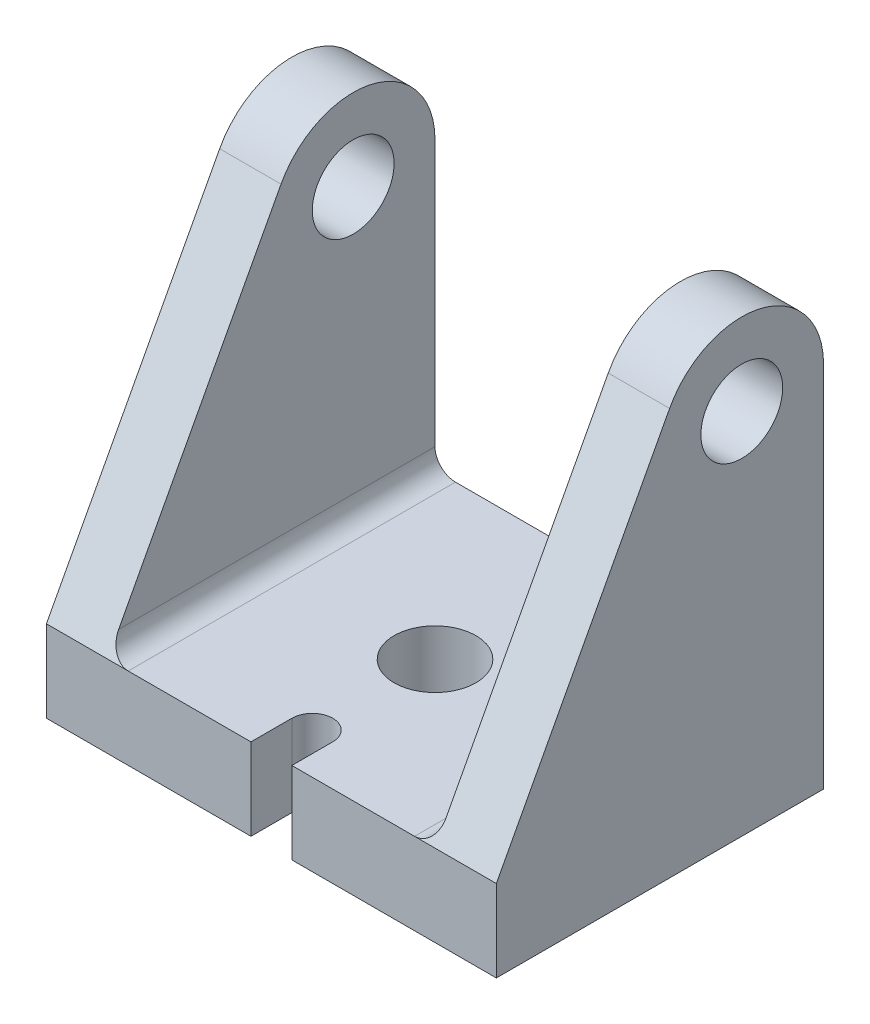
ISO-10303-21;
HEADER;
FILE_DESCRIPTION(('STEP AP214'),'2;1');
FILE_NAME('part.step','',(''),(''),'','','');
FILE_SCHEMA(('AUTOMOTIVE_DESIGN { 1 0 10303 214 1 1 1 1 }'));
ENDSEC;
DATA;
#1=APPLICATION_CONTEXT('core data for automotive mechanical design processes');
#2=APPLICATION_PROTOCOL_DEFINITION('international standard','automotive_design',2000,#1);
#3=PRODUCT_CONTEXT('',#1,'mechanical');
#4=PRODUCT('Part','Part','',(#3));
#5=PRODUCT_RELATED_PRODUCT_CATEGORY('part','',(#4));
#6=PRODUCT_DEFINITION_FORMATION('','',#4);
#7=PRODUCT_DEFINITION_CONTEXT('part definition',#1,'design');
#8=PRODUCT_DEFINITION('design','',#6,#7);
#9=PRODUCT_DEFINITION_SHAPE('','',#8);
#10=(LENGTH_UNIT() NAMED_UNIT(*) SI_UNIT(.MILLI.,.METRE.));
#11=(NAMED_UNIT(*) PLANE_ANGLE_UNIT() SI_UNIT($,.RADIAN.));
#12=(NAMED_UNIT(*) SI_UNIT($,.STERADIAN.) SOLID_ANGLE_UNIT());
#13=UNCERTAINTY_MEASURE_WITH_UNIT(LENGTH_MEASURE(1.E-05),#10,'distance_accuracy_value','');
#14=(GEOMETRIC_REPRESENTATION_CONTEXT(3) GLOBAL_UNCERTAINTY_ASSIGNED_CONTEXT((#13)) GLOBAL_UNIT_ASSIGNED_CONTEXT((#10,
#11,#12)) REPRESENTATION_CONTEXT('',''));
#15=CARTESIAN_POINT('',(0.,0.,0.));
#16=DIRECTION('',(0.,0.,1.));
#17=DIRECTION('',(1.,0.,0.));
#18=AXIS2_PLACEMENT_3D('',#15,#16,#17);
#19=CARTESIAN_POINT('',(-34.925,12.7,25.4));
#20=DIRECTION('',(0.,0.,-1.));
#21=DIRECTION('',(-1.,0.,0.));
#22=AXIS2_PLACEMENT_3D('',#19,#20,#21);
#23=PLANE('',#22);
#24=DIRECTION('',(1.,0.,0.));
#25=VECTOR('',#24,1.);
#26=CARTESIAN_POINT('',(-34.925,12.7,25.4));
#27=LINE('',#26,#25);
#28=CARTESIAN_POINT('',(3.175,12.7,25.4));
#29=VERTEX_POINT('',#28);
#30=CARTESIAN_POINT('',(22.225,12.7,25.4));
#31=VERTEX_POINT('',#30);
#32=EDGE_CURVE('E265',#29,#31,#27,.T.);
#33=ORIENTED_EDGE('',*,*,#32,.F.);
#34=DIRECTION('',(0.,1.,0.));
#35=VECTOR('',#34,1.);
#36=CARTESIAN_POINT('',(3.175,0.,25.4));
#37=LINE('',#36,#35);
#38=CARTESIAN_POINT('',(3.175,0.,25.4));
#39=VERTEX_POINT('',#38);
#40=EDGE_CURVE('E157',#39,#29,#37,.T.);
#41=ORIENTED_EDGE('',*,*,#40,.F.);
#42=DIRECTION('',(1.,0.,0.));
#43=VECTOR('',#42,1.);
#44=CARTESIAN_POINT('',(-34.925,0.,25.4));
#45=LINE('',#44,#43);
#46=CARTESIAN_POINT('',(34.925,0.,25.4));
#47=VERTEX_POINT('',#46);
#48=EDGE_CURVE('E273',#39,#47,#45,.T.);
#49=ORIENTED_EDGE('',*,*,#48,.T.);
#50=DIRECTION('',(0.,-1.,0.));
#51=VECTOR('',#50,1.);
#52=CARTESIAN_POINT('',(34.925,12.7,25.4));
#53=LINE('',#52,#51);
#54=CARTESIAN_POINT('',(34.925,12.7,25.4));
#55=VERTEX_POINT('',#54);
#56=EDGE_CURVE('E291',#55,#47,#53,.T.);
#57=ORIENTED_EDGE('',*,*,#56,.F.);
#58=DIRECTION('',(1.,0.,0.));
#59=VECTOR('',#58,1.);
#60=CARTESIAN_POINT('',(25.4,12.7,25.4));
#61=LINE('',#60,#59);
#62=EDGE_CURVE('E60',#31,#55,#61,.T.);
#63=ORIENTED_EDGE('',*,*,#62,.F.);
#64=EDGE_LOOP('',(#33,#41,#49,#57,#63));
#65=FACE_BOUND('',#64,.T.);
#66=ADVANCED_FACE('F43',(#65),#23,.F.);
#67=CARTESIAN_POINT('',(0.,12.7,0.));
#68=DIRECTION('',(0.,1.,0.));
#69=DIRECTION('',(0.,0.,1.));
#70=AXIS2_PLACEMENT_3D('',#67,#68,#69);
#71=PLANE('',#70);
#72=CARTESIAN_POINT('',(0.,12.7,0.));
#73=DIRECTION('',(0.,1.,0.));
#74=DIRECTION('',(0.,0.,1.));
#75=AXIS2_PLACEMENT_3D('',#72,#73,#74);
#76=CIRCLE('',#75,6.35);
#77=CARTESIAN_POINT('',(0.,12.7,6.35));
#78=VERTEX_POINT('',#77);
#79=EDGE_CURVE('E170',#78,#78,#76,.T.);
#80=ORIENTED_EDGE('',*,*,#79,.F.);
#81=EDGE_LOOP('',(#80));
#82=FACE_BOUND('',#81,.T.);
#83=ORIENTED_EDGE('',*,*,#32,.T.);
#84=DIRECTION('',(0.,0.,-1.));
#85=VECTOR('',#84,1.);
#86=CARTESIAN_POINT('',(22.225,12.7,-25.4));
#87=LINE('',#86,#85);
#88=CARTESIAN_POINT('',(22.225,12.7,-25.4));
#89=VERTEX_POINT('',#88);
#90=EDGE_CURVE('E303',#31,#89,#87,.T.);
#91=ORIENTED_EDGE('',*,*,#90,.T.);
#92=DIRECTION('',(-1.,0.,0.));
#93=VECTOR('',#92,1.);
#94=CARTESIAN_POINT('',(-34.925,12.7,-25.4));
#95=LINE('',#94,#93);
#96=CARTESIAN_POINT('',(-22.225,12.7,-25.4));
#97=VERTEX_POINT('',#96);
#98=EDGE_CURVE('E263',#89,#97,#95,.T.);
#99=ORIENTED_EDGE('',*,*,#98,.T.);
#100=DIRECTION('',(0.,0.,-1.));
#101=VECTOR('',#100,1.);
#102=CARTESIAN_POINT('',(-22.225,12.7,25.4));
#103=LINE('',#102,#101);
#104=CARTESIAN_POINT('',(-22.225,12.7,25.4));
#105=VERTEX_POINT('',#104);
#106=EDGE_CURVE('E299',#97,#105,#103,.F.);
#107=ORIENTED_EDGE('',*,*,#106,.T.);
#108=CARTESIAN_POINT('',(-3.175,12.7,25.4));
#109=VERTEX_POINT('',#108);
#110=EDGE_CURVE('E264',#105,#109,#27,.T.);
#111=ORIENTED_EDGE('',*,*,#110,.T.);
#112=DIRECTION('',(0.,0.,1.));
#113=VECTOR('',#112,1.);
#114=CARTESIAN_POINT('',(-3.175,12.7,19.05));
#115=LINE('',#114,#113);
#116=CARTESIAN_POINT('',(-3.175,12.7,19.05));
#117=VERTEX_POINT('',#116);
#118=EDGE_CURVE('E165',#117,#109,#115,.T.);
#119=ORIENTED_EDGE('',*,*,#118,.F.);
#120=CARTESIAN_POINT('',(0.,12.7,19.05));
#121=DIRECTION('',(0.,1.,0.));
#122=DIRECTION('',(0.,0.,1.));
#123=AXIS2_PLACEMENT_3D('',#120,#121,#122);
#124=CIRCLE('',#123,3.175);
#125=CARTESIAN_POINT('',(3.175,12.7,19.05));
#126=VERTEX_POINT('',#125);
#127=EDGE_CURVE('E150',#126,#117,#124,.T.);
#128=ORIENTED_EDGE('',*,*,#127,.F.);
#129=DIRECTION('',(0.,0.,-1.));
#130=VECTOR('',#129,1.);
#131=CARTESIAN_POINT('',(3.175,12.7,19.05));
#132=LINE('',#131,#130);
#133=EDGE_CURVE('E160',#29,#126,#132,.T.);
#134=ORIENTED_EDGE('',*,*,#133,.F.);
#135=EDGE_LOOP('',(#83,#91,#99,#107,#111,#119,#128,#134));
#136=FACE_BOUND('',#135,.T.);
#137=ADVANCED_FACE('F167',(#82,#136),#71,.T.);
#138=CARTESIAN_POINT('',(-34.925,12.7,-25.4));
#139=DIRECTION('',(1.,0.,0.));
#140=DIRECTION('',(0.,0.,-1.));
#141=AXIS2_PLACEMENT_3D('',#138,#139,#140);
#142=PLANE('',#141);
#143=DIRECTION('',(0.,0.,1.));
#144=VECTOR('',#143,1.);
#145=CARTESIAN_POINT('',(-34.925,0.,-25.4));
#146=LINE('',#145,#144);
#147=CARTESIAN_POINT('',(-34.925,0.,-25.4));
#148=VERTEX_POINT('',#147);
#149=CARTESIAN_POINT('',(-34.925,0.,25.4));
#150=VERTEX_POINT('',#149);
#151=EDGE_CURVE('E258',#148,#150,#146,.T.);
#152=ORIENTED_EDGE('',*,*,#151,.T.);
#153=DIRECTION('',(0.,-1.,0.));
#154=VECTOR('',#153,1.);
#155=CARTESIAN_POINT('',(-34.925,12.7,25.4));
#156=LINE('',#155,#154);
#157=CARTESIAN_POINT('',(-34.925,12.7,25.4));
#158=VERTEX_POINT('',#157);
#159=EDGE_CURVE('E295',#158,#150,#156,.T.);
#160=ORIENTED_EDGE('',*,*,#159,.F.);
#161=DIRECTION('',(0.,-0.882352941176471,0.470588235294118));
#162=VECTOR('',#161,1.);
#163=CARTESIAN_POINT('',(-34.925,33.7934256055363,14.1501730103806));
#164=LINE('',#163,#162);
#165=CARTESIAN_POINT('',(-34.925,63.1264705882353,-1.49411764705883));
#166=VERTEX_POINT('',#165);
#167=EDGE_CURVE('E193',#166,#158,#164,.T.);
#168=ORIENTED_EDGE('',*,*,#167,.F.);
#169=CARTESIAN_POINT('',(-34.925,57.15,-12.7));
#170=DIRECTION('',(1.,0.,0.));
#171=DIRECTION('',(0.,0.,-1.));
#172=AXIS2_PLACEMENT_3D('',#169,#170,#171);
#173=CIRCLE('',#172,12.7);
#174=CARTESIAN_POINT('',(-34.925,57.15,-25.4));
#175=VERTEX_POINT('',#174);
#176=EDGE_CURVE('E203',#175,#166,#173,.T.);
#177=ORIENTED_EDGE('',*,*,#176,.F.);
#178=DIRECTION('',(0.,-1.,0.));
#179=VECTOR('',#178,1.);
#180=CARTESIAN_POINT('',(-34.925,12.7,-25.4));
#181=LINE('',#180,#179);
#182=EDGE_CURVE('E269',#175,#148,#181,.T.);
#183=ORIENTED_EDGE('',*,*,#182,.T.);
#184=EDGE_LOOP('',(#152,#160,#168,#177,#183));
#185=FACE_BOUND('',#184,.T.);
#186=CARTESIAN_POINT('',(-34.925,57.15,-12.7));
#187=DIRECTION('',(1.,0.,0.));
#188=DIRECTION('',(0.,0.,-1.));
#189=AXIS2_PLACEMENT_3D('',#186,#187,#188);
#190=CIRCLE('',#189,6.35);
#191=CARTESIAN_POINT('',(-34.925,57.15,-6.35));
#192=VERTEX_POINT('',#191);
#193=EDGE_CURVE('E194',#192,#192,#190,.T.);
#194=ORIENTED_EDGE('',*,*,#193,.T.);
#195=EDGE_LOOP('',(#194));
#196=FACE_BOUND('',#195,.T.);
#197=ADVANCED_FACE('F346',(#185,#196),#142,.F.);
#198=CARTESIAN_POINT('',(-3.175,0.,25.4));
#199=VERTEX_POINT('',#198);
#200=EDGE_CURVE('E274',#150,#199,#45,.T.);
#201=ORIENTED_EDGE('',*,*,#200,.T.);
#202=DIRECTION('',(0.,1.,0.));
#203=VECTOR('',#202,1.);
#204=CARTESIAN_POINT('',(-3.175,0.,25.4));
#205=LINE('',#204,#203);
#206=EDGE_CURVE('E352',#199,#109,#205,.T.);
#207=ORIENTED_EDGE('',*,*,#206,.T.);
#208=ORIENTED_EDGE('',*,*,#110,.F.);
#209=EDGE_CURVE('E259',#158,#105,#27,.T.);
#210=ORIENTED_EDGE('',*,*,#209,.F.);
#211=ORIENTED_EDGE('',*,*,#159,.T.);
#212=EDGE_LOOP('',(#201,#207,#208,#210,#211));
#213=FACE_BOUND('',#212,.T.);
#214=ADVANCED_FACE('F350',(#213),#23,.F.);
#215=CARTESIAN_POINT('',(34.925,12.7,-25.4));
#216=DIRECTION('',(-1.,0.,0.));
#217=DIRECTION('',(0.,0.,1.));
#218=AXIS2_PLACEMENT_3D('',#215,#216,#217);
#219=PLANE('',#218);
#220=DIRECTION('',(0.,0.,-1.));
#221=VECTOR('',#220,1.);
#222=CARTESIAN_POINT('',(34.925,0.,-25.4));
#223=LINE('',#222,#221);
#224=CARTESIAN_POINT('',(34.925,0.,-25.4));
#225=VERTEX_POINT('',#224);
#226=EDGE_CURVE('E278',#47,#225,#223,.T.);
#227=ORIENTED_EDGE('',*,*,#226,.T.);
#228=DIRECTION('',(0.,-1.,0.));
#229=VECTOR('',#228,1.);
#230=CARTESIAN_POINT('',(34.925,12.7,-25.4));
#231=LINE('',#230,#229);
#232=CARTESIAN_POINT('',(34.925,57.15,-25.4));
#233=VERTEX_POINT('',#232);
#234=EDGE_CURVE('E287',#233,#225,#231,.T.);
#235=ORIENTED_EDGE('',*,*,#234,.F.);
#236=CARTESIAN_POINT('',(34.925,57.15,-12.7));
#237=DIRECTION('',(-1.,0.,0.));
#238=DIRECTION('',(0.,0.,1.));
#239=AXIS2_PLACEMENT_3D('',#236,#237,#238);
#240=CIRCLE('',#239,12.7);
#241=CARTESIAN_POINT('',(34.925,63.1264705882353,-1.49411764705882));
#242=VERTEX_POINT('',#241);
#243=EDGE_CURVE('E227',#242,#233,#240,.T.);
#244=ORIENTED_EDGE('',*,*,#243,.F.);
#245=DIRECTION('',(0.,-0.882352941176471,0.470588235294117));
#246=VECTOR('',#245,1.);
#247=CARTESIAN_POINT('',(34.925,33.7934256055363,14.1501730103806));
#248=LINE('',#247,#246);
#249=EDGE_CURVE('E236',#242,#55,#248,.T.);
#250=ORIENTED_EDGE('',*,*,#249,.T.);
#251=ORIENTED_EDGE('',*,*,#56,.T.);
#252=EDGE_LOOP('',(#227,#235,#244,#250,#251));
#253=FACE_BOUND('',#252,.T.);
#254=CARTESIAN_POINT('',(34.925,57.15,-12.7));
#255=DIRECTION('',(-1.,0.,0.));
#256=DIRECTION('',(0.,0.,1.));
#257=AXIS2_PLACEMENT_3D('',#254,#255,#256);
#258=CIRCLE('',#257,6.35);
#259=CARTESIAN_POINT('',(34.925,57.15,-19.05));
#260=VERTEX_POINT('',#259);
#261=EDGE_CURVE('E222',#260,#260,#258,.T.);
#262=ORIENTED_EDGE('',*,*,#261,.T.);
#263=EDGE_LOOP('',(#262));
#264=FACE_BOUND('',#263,.T.);
#265=ADVANCED_FACE('F414',(#253,#264),#219,.F.);
#266=CARTESIAN_POINT('',(-34.925,12.7,-25.4));
#267=DIRECTION('',(0.,0.,1.));
#268=DIRECTION('',(1.,0.,0.));
#269=AXIS2_PLACEMENT_3D('',#266,#267,#268);
#270=PLANE('',#269);
#271=DIRECTION('',(-1.,0.,0.));
#272=VECTOR('',#271,1.);
#273=CARTESIAN_POINT('',(-34.925,0.,-25.4));
#274=LINE('',#273,#272);
#275=EDGE_CURVE('E281',#225,#148,#274,.T.);
#276=ORIENTED_EDGE('',*,*,#275,.T.);
#277=ORIENTED_EDGE('',*,*,#182,.F.);
#278=DIRECTION('',(-1.,0.,0.));
#279=VECTOR('',#278,1.);
#280=CARTESIAN_POINT('',(-25.4,57.15,-25.4));
#281=LINE('',#280,#279);
#282=CARTESIAN_POINT('',(-25.4,57.15,-25.4));
#283=VERTEX_POINT('',#282);
#284=EDGE_CURVE('E218',#283,#175,#281,.T.);
#285=ORIENTED_EDGE('',*,*,#284,.F.);
#286=DIRECTION('',(0.,1.,0.));
#287=VECTOR('',#286,1.);
#288=CARTESIAN_POINT('',(-25.4,12.7,-25.4));
#289=LINE('',#288,#287);
#290=CARTESIAN_POINT('',(-25.4,15.875,-25.4));
#291=VERTEX_POINT('',#290);
#292=EDGE_CURVE('E202',#291,#283,#289,.T.);
#293=ORIENTED_EDGE('',*,*,#292,.F.);
#294=CARTESIAN_POINT('',(-22.225,15.875,-25.4));
#295=DIRECTION('',(0.,0.,1.));
#296=DIRECTION('',(1.,0.,0.));
#297=AXIS2_PLACEMENT_3D('',#294,#295,#296);
#298=CIRCLE('',#297,3.175);
#299=EDGE_CURVE('E53',#291,#97,#298,.T.);
#300=ORIENTED_EDGE('',*,*,#299,.T.);
#301=ORIENTED_EDGE('',*,*,#98,.F.);
#302=CARTESIAN_POINT('',(22.225,15.875,-25.4));
#303=DIRECTION('',(0.,0.,1.));
#304=DIRECTION('',(1.,0.,0.));
#305=AXIS2_PLACEMENT_3D('',#302,#303,#304);
#306=CIRCLE('',#305,3.175);
#307=CARTESIAN_POINT('',(25.4,15.875,-25.4));
#308=VERTEX_POINT('',#307);
#309=EDGE_CURVE('E314',#89,#308,#306,.T.);
#310=ORIENTED_EDGE('',*,*,#309,.T.);
#311=DIRECTION('',(0.,1.,0.));
#312=VECTOR('',#311,1.);
#313=CARTESIAN_POINT('',(25.4,12.7,-25.4));
#314=LINE('',#313,#312);
#315=CARTESIAN_POINT('',(25.4,57.15,-25.4));
#316=VERTEX_POINT('',#315);
#317=EDGE_CURVE('E235',#308,#316,#314,.T.);
#318=ORIENTED_EDGE('',*,*,#317,.T.);
#319=DIRECTION('',(1.,0.,0.));
#320=VECTOR('',#319,1.);
#321=CARTESIAN_POINT('',(25.4,57.15,-25.4));
#322=LINE('',#321,#320);
#323=EDGE_CURVE('E254',#316,#233,#322,.T.);
#324=ORIENTED_EDGE('',*,*,#323,.T.);
#325=ORIENTED_EDGE('',*,*,#234,.T.);
#326=EDGE_LOOP('',(#276,#277,#285,#293,#300,#301,#310,#318,#324,#325));
#327=FACE_BOUND('',#326,.T.);
#328=ADVANCED_FACE('F324',(#327),#270,.F.);
#329=CARTESIAN_POINT('',(0.,0.,0.));
#330=DIRECTION('',(0.,1.,0.));
#331=DIRECTION('',(0.,0.,1.));
#332=AXIS2_PLACEMENT_3D('',#329,#330,#331);
#333=PLANE('',#332);
#334=CARTESIAN_POINT('',(0.,0.,0.));
#335=DIRECTION('',(0.,1.,0.));
#336=DIRECTION('',(0.,0.,1.));
#337=AXIS2_PLACEMENT_3D('',#334,#335,#336);
#338=CIRCLE('',#337,6.35);
#339=CARTESIAN_POINT('',(0.,0.,6.35));
#340=VERTEX_POINT('',#339);
#341=EDGE_CURVE('E175',#340,#340,#338,.T.);
#342=ORIENTED_EDGE('',*,*,#341,.T.);
#343=EDGE_LOOP('',(#342));
#344=FACE_BOUND('',#343,.T.);
#345=ORIENTED_EDGE('',*,*,#48,.F.);
#346=DIRECTION('',(0.,0.,-1.));
#347=VECTOR('',#346,1.);
#348=CARTESIAN_POINT('',(3.175,0.,19.05));
#349=LINE('',#348,#347);
#350=CARTESIAN_POINT('',(3.175,0.,19.05));
#351=VERTEX_POINT('',#350);
#352=EDGE_CURVE('E179',#39,#351,#349,.T.);
#353=ORIENTED_EDGE('',*,*,#352,.T.);
#354=CARTESIAN_POINT('',(0.,0.,19.05));
#355=DIRECTION('',(0.,1.,0.));
#356=DIRECTION('',(0.,0.,1.));
#357=AXIS2_PLACEMENT_3D('',#354,#355,#356);
#358=CIRCLE('',#357,3.175);
#359=CARTESIAN_POINT('',(-3.175,0.,19.05));
#360=VERTEX_POINT('',#359);
#361=EDGE_CURVE('E153',#351,#360,#358,.T.);
#362=ORIENTED_EDGE('',*,*,#361,.T.);
#363=DIRECTION('',(0.,0.,1.));
#364=VECTOR('',#363,1.);
#365=CARTESIAN_POINT('',(-3.175,0.,19.05));
#366=LINE('',#365,#364);
#367=EDGE_CURVE('E182',#360,#199,#366,.T.);
#368=ORIENTED_EDGE('',*,*,#367,.T.);
#369=ORIENTED_EDGE('',*,*,#200,.F.);
#370=ORIENTED_EDGE('',*,*,#151,.F.);
#371=ORIENTED_EDGE('',*,*,#275,.F.);
#372=ORIENTED_EDGE('',*,*,#226,.F.);
#373=EDGE_LOOP('',(#345,#353,#362,#368,#369,#370,#371,#372));
#374=FACE_BOUND('',#373,.T.);
#375=ADVANCED_FACE('F377',(#344,#374),#333,.F.);
#376=CARTESIAN_POINT('',(25.4,57.15,-12.7));
#377=DIRECTION('',(-1.,0.,0.));
#378=DIRECTION('',(0.,0.,1.));
#379=AXIS2_PLACEMENT_3D('',#376,#377,#378);
#380=PLANE('',#379);
#381=ORIENTED_EDGE('',*,*,#317,.F.);
#382=DIRECTION('',(0.,0.,-1.));
#383=VECTOR('',#382,1.);
#384=CARTESIAN_POINT('',(25.4,15.875,25.4));
#385=LINE('',#384,#383);
#386=CARTESIAN_POINT('',(25.4,15.875,23.7066666666667));
#387=VERTEX_POINT('',#386);
#388=EDGE_CURVE('E307',#308,#387,#385,.F.);
#389=ORIENTED_EDGE('',*,*,#388,.T.);
#390=DIRECTION('',(0.,-0.882352941176471,0.470588235294117));
#391=VECTOR('',#390,1.);
#392=CARTESIAN_POINT('',(25.4,33.7934256055363,14.1501730103806));
#393=LINE('',#392,#391);
#394=CARTESIAN_POINT('',(25.4,63.1264705882353,-1.49411764705882));
#395=VERTEX_POINT('',#394);
#396=EDGE_CURVE('E239',#395,#387,#393,.T.);
#397=ORIENTED_EDGE('',*,*,#396,.F.);
#398=CARTESIAN_POINT('',(25.4,57.15,-12.7));
#399=DIRECTION('',(-1.,0.,0.));
#400=DIRECTION('',(0.,0.,1.));
#401=AXIS2_PLACEMENT_3D('',#398,#399,#400);
#402=CIRCLE('',#401,12.7);
#403=EDGE_CURVE('E231',#395,#316,#402,.T.);
#404=ORIENTED_EDGE('',*,*,#403,.T.);
#405=EDGE_LOOP('',(#381,#389,#397,#404));
#406=FACE_BOUND('',#405,.T.);
#407=CARTESIAN_POINT('',(25.4,57.15,-12.7));
#408=DIRECTION('',(-1.,0.,0.));
#409=DIRECTION('',(0.,0.,1.));
#410=AXIS2_PLACEMENT_3D('',#407,#408,#409);
#411=CIRCLE('',#410,6.35);
#412=CARTESIAN_POINT('',(25.4,57.15,-19.05));
#413=VERTEX_POINT('',#412);
#414=EDGE_CURVE('E223',#413,#413,#411,.T.);
#415=ORIENTED_EDGE('',*,*,#414,.F.);
#416=EDGE_LOOP('',(#415));
#417=FACE_BOUND('',#416,.T.);
#418=ADVANCED_FACE('F365',(#406,#417),#380,.T.);
#419=CARTESIAN_POINT('',(25.4,57.15,-12.7));
#420=DIRECTION('',(1.,0.,0.));
#421=DIRECTION('',(0.,0.,-1.));
#422=AXIS2_PLACEMENT_3D('',#419,#420,#421);
#423=CYLINDRICAL_SURFACE('',#422,12.7);
#424=ORIENTED_EDGE('',*,*,#243,.T.);
#425=ORIENTED_EDGE('',*,*,#323,.F.);
#426=ORIENTED_EDGE('',*,*,#403,.F.);
#427=DIRECTION('',(1.,0.,0.));
#428=VECTOR('',#427,1.);
#429=CARTESIAN_POINT('',(25.4,63.1264705882353,-1.49411764705882));
#430=LINE('',#429,#428);
#431=EDGE_CURVE('E243',#395,#242,#430,.T.);
#432=ORIENTED_EDGE('',*,*,#431,.T.);
#433=EDGE_LOOP('',(#424,#425,#426,#432));
#434=FACE_BOUND('',#433,.T.);
#435=ADVANCED_FACE('F370',(#434),#423,.T.);
#436=CARTESIAN_POINT('',(25.4,33.7934256055363,14.1501730103806));
#437=DIRECTION('',(0.,0.470588235294117,0.882352941176471));
#438=DIRECTION('',(0.,-0.882352941176471,0.470588235294117));
#439=AXIS2_PLACEMENT_3D('',#436,#437,#438);
#440=PLANE('',#439);
#441=ORIENTED_EDGE('',*,*,#249,.F.);
#442=ORIENTED_EDGE('',*,*,#431,.F.);
#443=ORIENTED_EDGE('',*,*,#396,.T.);
#444=CARTESIAN_POINT('',(22.225,15.875,23.7066666666667));
#445=DIRECTION('',(0.,0.470588235294117,0.882352941176471));
#446=DIRECTION('',(0.,-0.882352941176471,0.470588235294117));
#447=AXIS2_PLACEMENT_3D('',#444,#445,#446);
#448=ELLIPSE('',#447,3.59833333333333,3.175);
#449=EDGE_CURVE('E317',#387,#31,#448,.F.);
#450=ORIENTED_EDGE('',*,*,#449,.T.);
#451=ORIENTED_EDGE('',*,*,#62,.T.);
#452=EDGE_LOOP('',(#441,#442,#443,#450,#451));
#453=FACE_BOUND('',#452,.T.);
#454=ADVANCED_FACE('F358',(#453),#440,.T.);
#455=CARTESIAN_POINT('',(25.4,57.15,-12.7));
#456=DIRECTION('',(1.,0.,0.));
#457=DIRECTION('',(0.,0.,-1.));
#458=AXIS2_PLACEMENT_3D('',#455,#456,#457);
#459=CYLINDRICAL_SURFACE('',#458,6.35);
#460=CARTESIAN_POINT('',(25.4,57.15,-19.05));
#461=CARTESIAN_POINT('',(25.49921875,57.15,-19.05));
#462=CARTESIAN_POINT('',(25.5984375,57.15,-19.05));
#463=CARTESIAN_POINT('',(25.796875,57.15,-19.05));
#464=CARTESIAN_POINT('',(25.89609375,57.15,-19.05));
#465=CARTESIAN_POINT('',(26.09453125,57.15,-19.05));
#466=CARTESIAN_POINT('',(26.19375,57.15,-19.05));
#467=CARTESIAN_POINT('',(26.3921875,57.15,-19.05));
#468=CARTESIAN_POINT('',(26.49140625,57.15,-19.05));
#469=CARTESIAN_POINT('',(26.68984375,57.15,-19.05));
#470=CARTESIAN_POINT('',(26.7890625,57.15,-19.05));
#471=CARTESIAN_POINT('',(26.9875,57.15,-19.05));
#472=CARTESIAN_POINT('',(27.08671875,57.15,-19.05));
#473=CARTESIAN_POINT('',(27.28515625,57.15,-19.05));
#474=CARTESIAN_POINT('',(27.384375,57.15,-19.05));
#475=CARTESIAN_POINT('',(27.5828125,57.15,-19.05));
#476=CARTESIAN_POINT('',(27.68203125,57.15,-19.05));
#477=CARTESIAN_POINT('',(27.88046875,57.15,-19.05));
#478=CARTESIAN_POINT('',(27.9796875,57.15,-19.05));
#479=CARTESIAN_POINT('',(28.178125,57.15,-19.05));
#480=CARTESIAN_POINT('',(28.27734375,57.15,-19.05));
#481=CARTESIAN_POINT('',(28.47578125,57.15,-19.05));
#482=CARTESIAN_POINT('',(28.575,57.15,-19.05));
#483=CARTESIAN_POINT('',(28.7734375,57.15,-19.05));
#484=CARTESIAN_POINT('',(28.87265625,57.15,-19.05));
#485=CARTESIAN_POINT('',(29.07109375,57.15,-19.05));
#486=CARTESIAN_POINT('',(29.1703125,57.15,-19.05));
#487=CARTESIAN_POINT('',(29.36875,57.15,-19.05));
#488=CARTESIAN_POINT('',(29.46796875,57.15,-19.05));
#489=CARTESIAN_POINT('',(29.66640625,57.15,-19.05));
#490=CARTESIAN_POINT('',(29.765625,57.15,-19.05));
#491=CARTESIAN_POINT('',(29.9640625,57.15,-19.05));
#492=CARTESIAN_POINT('',(30.06328125,57.15,-19.05));
#493=CARTESIAN_POINT('',(30.26171875,57.15,-19.05));
#494=CARTESIAN_POINT('',(30.3609375,57.15,-19.05));
#495=CARTESIAN_POINT('',(30.559375,57.15,-19.05));
#496=CARTESIAN_POINT('',(30.65859375,57.15,-19.05));
#497=CARTESIAN_POINT('',(30.85703125,57.15,-19.05));
#498=CARTESIAN_POINT('',(30.95625,57.15,-19.05));
#499=CARTESIAN_POINT('',(31.1546875,57.15,-19.05));
#500=CARTESIAN_POINT('',(31.25390625,57.15,-19.05));
#501=CARTESIAN_POINT('',(31.45234375,57.15,-19.05));
#502=CARTESIAN_POINT('',(31.5515625,57.15,-19.05));
#503=CARTESIAN_POINT('',(31.75,57.15,-19.05));
#504=CARTESIAN_POINT('',(31.84921875,57.15,-19.05));
#505=CARTESIAN_POINT('',(32.04765625,57.15,-19.05));
#506=CARTESIAN_POINT('',(32.146875,57.15,-19.05));
#507=CARTESIAN_POINT('',(32.3453125,57.15,-19.05));
#508=CARTESIAN_POINT('',(32.44453125,57.15,-19.05));
#509=CARTESIAN_POINT('',(32.64296875,57.15,-19.05));
#510=CARTESIAN_POINT('',(32.7421875,57.15,-19.05));
#511=CARTESIAN_POINT('',(32.940625,57.15,-19.05));
#512=CARTESIAN_POINT('',(33.03984375,57.15,-19.05));
#513=CARTESIAN_POINT('',(33.23828125,57.15,-19.05));
#514=CARTESIAN_POINT('',(33.3375,57.15,-19.05));
#515=CARTESIAN_POINT('',(33.5359375,57.15,-19.05));
#516=CARTESIAN_POINT('',(33.63515625,57.15,-19.05));
#517=CARTESIAN_POINT('',(33.83359375,57.15,-19.05));
#518=CARTESIAN_POINT('',(33.9328125,57.15,-19.05));
#519=CARTESIAN_POINT('',(34.13125,57.15,-19.05));
#520=CARTESIAN_POINT('',(34.23046875,57.15,-19.05));
#521=CARTESIAN_POINT('',(34.42890625,57.15,-19.05));
#522=CARTESIAN_POINT('',(34.528125,57.15,-19.05));
#523=CARTESIAN_POINT('',(34.7265625,57.15,-19.05));
#524=CARTESIAN_POINT('',(34.82578125,57.15,-19.05));
#525=CARTESIAN_POINT('',(34.925,57.15,-19.05));
#526=B_SPLINE_CURVE_WITH_KNOTS('',3,(#460,#461,#462,#463,#464,#465,#466,#467,#468,#469,#470,
#471,#472,#473,#474,#475,#476,#477,#478,#479,#480,#481,#482,#483,#484,#485,#486,#487,#488,#489,
#490,#491,#492,#493,#494,#495,#496,#497,#498,#499,#500,#501,#502,#503,#504,#505,#506,#507,#508,
#509,#510,#511,#512,#513,#514,#515,#516,#517,#518,#519,#520,#521,#522,#523,#524,#525),
.UNSPECIFIED.,.F.,.F.,(4,2,2,2,2,2,2,2,2,2,2,2,2,2,2,2,2,2,2,2,2,2,2,2,2,2,2,2,2,2,2,2,4),(0.,
0.297656249999997,0.595312499999997,0.892968749999997,1.190625,1.48828125,1.7859375,2.08359375,
2.38125,2.67890625,2.9765625,3.27421874999999,3.571875,3.86953125,4.1671875,4.46484375,4.7625,
5.06015625,5.3578125,5.65546875,5.953125,6.25078125,6.5484375,6.84609375,7.14375,7.44140625,
7.7390625,8.03671875,8.334375,8.63203124999999,8.92968749999999,9.22734374999999,
9.52499999999999),.UNSPECIFIED.);
#527=EDGE_CURVE('BSEAM450',#413,#260,#526,.T.);
#528=ORIENTED_EDGE('',*,*,#414,.T.);
#529=ORIENTED_EDGE('',*,*,#261,.F.);
#530=ORIENTED_EDGE('',*,*,#527,.T.);
#531=ORIENTED_EDGE('',*,*,#527,.F.);
#532=EDGE_LOOP('',(#528,#530,#529,#531));
#533=FACE_BOUND('',#532,.T.);
#534=ADVANCED_FACE('F450',(#533),#459,.F.);
#535=CARTESIAN_POINT('',(-25.4,57.15,-12.7));
#536=DIRECTION('',(1.,0.,0.));
#537=DIRECTION('',(0.,0.,-1.));
#538=AXIS2_PLACEMENT_3D('',#535,#536,#537);
#539=PLANE('',#538);
#540=DIRECTION('',(0.,-0.882352941176471,0.470588235294118));
#541=VECTOR('',#540,1.);
#542=CARTESIAN_POINT('',(-25.4,33.7934256055363,14.1501730103806));
#543=LINE('',#542,#541);
#544=CARTESIAN_POINT('',(-25.4,63.1264705882353,-1.49411764705883));
#545=VERTEX_POINT('',#544);
#546=CARTESIAN_POINT('',(-25.4,15.875,23.7066666666667));
#547=VERTEX_POINT('',#546);
#548=EDGE_CURVE('E198',#545,#547,#543,.T.);
#549=ORIENTED_EDGE('',*,*,#548,.T.);
#550=DIRECTION('',(0.,0.,-1.));
#551=VECTOR('',#550,1.);
#552=CARTESIAN_POINT('',(-25.4,15.875,-25.4));
#553=LINE('',#552,#551);
#554=EDGE_CURVE('E310',#547,#291,#553,.T.);
#555=ORIENTED_EDGE('',*,*,#554,.T.);
#556=ORIENTED_EDGE('',*,*,#292,.T.);
#557=CARTESIAN_POINT('',(-25.4,57.15,-12.7));
#558=DIRECTION('',(1.,0.,0.));
#559=DIRECTION('',(0.,0.,-1.));
#560=AXIS2_PLACEMENT_3D('',#557,#558,#559);
#561=CIRCLE('',#560,12.7);
#562=EDGE_CURVE('E206',#283,#545,#561,.T.);
#563=ORIENTED_EDGE('',*,*,#562,.T.);
#564=EDGE_LOOP('',(#549,#555,#556,#563));
#565=FACE_BOUND('',#564,.T.);
#566=CARTESIAN_POINT('',(-25.4,57.15,-12.7));
#567=DIRECTION('',(1.,0.,0.));
#568=DIRECTION('',(0.,0.,-1.));
#569=AXIS2_PLACEMENT_3D('',#566,#567,#568);
#570=CIRCLE('',#569,6.35);
#571=CARTESIAN_POINT('',(-25.4,57.15,-6.35));
#572=VERTEX_POINT('',#571);
#573=EDGE_CURVE('E189',#572,#572,#570,.T.);
#574=ORIENTED_EDGE('',*,*,#573,.F.);
#575=EDGE_LOOP('',(#574));
#576=FACE_BOUND('',#575,.T.);
#577=ADVANCED_FACE('F336',(#565,#576),#539,.T.);
#578=CARTESIAN_POINT('',(-25.4,33.7934256055363,14.1501730103806));
#579=DIRECTION('',(0.,-0.470588235294117,-0.882352941176471));
#580=DIRECTION('',(0.,0.882352941176471,-0.470588235294117));
#581=AXIS2_PLACEMENT_3D('',#578,#579,#580);
#582=PLANE('',#581);
#583=ORIENTED_EDGE('',*,*,#167,.T.);
#584=ORIENTED_EDGE('',*,*,#209,.T.);
#585=CARTESIAN_POINT('',(-22.225,15.875,23.7066666666667));
#586=DIRECTION('',(0.,-0.470588235294117,-0.882352941176471));
#587=DIRECTION('',(0.,-0.882352941176471,0.470588235294117));
#588=AXIS2_PLACEMENT_3D('',#585,#586,#587);
#589=ELLIPSE('',#588,3.59833333333333,3.175);
#590=EDGE_CURVE('E11',#105,#547,#589,.T.);
#591=ORIENTED_EDGE('',*,*,#590,.T.);
#592=ORIENTED_EDGE('',*,*,#548,.F.);
#593=DIRECTION('',(-1.,0.,0.));
#594=VECTOR('',#593,1.);
#595=CARTESIAN_POINT('',(-25.4,63.1264705882353,-1.49411764705883));
#596=LINE('',#595,#594);
#597=EDGE_CURVE('E209',#545,#166,#596,.T.);
#598=ORIENTED_EDGE('',*,*,#597,.T.);
#599=EDGE_LOOP('',(#583,#584,#591,#592,#598));
#600=FACE_BOUND('',#599,.T.);
#601=ADVANCED_FACE('F334',(#600),#582,.F.);
#602=CARTESIAN_POINT('',(-25.4,57.15,-12.7));
#603=DIRECTION('',(-1.,0.,0.));
#604=DIRECTION('',(0.,0.,1.));
#605=AXIS2_PLACEMENT_3D('',#602,#603,#604);
#606=CYLINDRICAL_SURFACE('',#605,12.7);
#607=ORIENTED_EDGE('',*,*,#176,.T.);
#608=ORIENTED_EDGE('',*,*,#597,.F.);
#609=ORIENTED_EDGE('',*,*,#562,.F.);
#610=ORIENTED_EDGE('',*,*,#284,.T.);
#611=EDGE_LOOP('',(#607,#608,#609,#610));
#612=FACE_BOUND('',#611,.T.);
#613=ADVANCED_FACE('F341',(#612),#606,.T.);
#614=CARTESIAN_POINT('',(-25.4,57.15,-12.7));
#615=DIRECTION('',(-1.,0.,0.));
#616=DIRECTION('',(0.,0.,1.));
#617=AXIS2_PLACEMENT_3D('',#614,#615,#616);
#618=CYLINDRICAL_SURFACE('',#617,6.35);
#619=CARTESIAN_POINT('',(-25.4,57.15,-6.35));
#620=CARTESIAN_POINT('',(-25.49921875,57.15,-6.35));
#621=CARTESIAN_POINT('',(-25.5984375,57.15,-6.35));
#622=CARTESIAN_POINT('',(-25.796875,57.15,-6.35));
#623=CARTESIAN_POINT('',(-25.89609375,57.15,-6.35));
#624=CARTESIAN_POINT('',(-26.09453125,57.15,-6.35));
#625=CARTESIAN_POINT('',(-26.19375,57.15,-6.35));
#626=CARTESIAN_POINT('',(-26.3921875,57.15,-6.35));
#627=CARTESIAN_POINT('',(-26.49140625,57.15,-6.35));
#628=CARTESIAN_POINT('',(-26.68984375,57.15,-6.35));
#629=CARTESIAN_POINT('',(-26.7890625,57.15,-6.35));
#630=CARTESIAN_POINT('',(-26.9875,57.15,-6.35));
#631=CARTESIAN_POINT('',(-27.08671875,57.15,-6.35));
#632=CARTESIAN_POINT('',(-27.28515625,57.15,-6.35));
#633=CARTESIAN_POINT('',(-27.384375,57.15,-6.35));
#634=CARTESIAN_POINT('',(-27.5828125,57.15,-6.35));
#635=CARTESIAN_POINT('',(-27.68203125,57.15,-6.35));
#636=CARTESIAN_POINT('',(-27.88046875,57.15,-6.35));
#637=CARTESIAN_POINT('',(-27.9796875,57.15,-6.35));
#638=CARTESIAN_POINT('',(-28.178125,57.15,-6.35));
#639=CARTESIAN_POINT('',(-28.27734375,57.15,-6.35));
#640=CARTESIAN_POINT('',(-28.47578125,57.15,-6.35));
#641=CARTESIAN_POINT('',(-28.575,57.15,-6.35));
#642=CARTESIAN_POINT('',(-28.7734375,57.15,-6.35));
#643=CARTESIAN_POINT('',(-28.87265625,57.15,-6.35));
#644=CARTESIAN_POINT('',(-29.07109375,57.15,-6.35));
#645=CARTESIAN_POINT('',(-29.1703125,57.15,-6.35));
#646=CARTESIAN_POINT('',(-29.36875,57.15,-6.35));
#647=CARTESIAN_POINT('',(-29.46796875,57.15,-6.35));
#648=CARTESIAN_POINT('',(-29.66640625,57.15,-6.35));
#649=CARTESIAN_POINT('',(-29.765625,57.15,-6.35));
#650=CARTESIAN_POINT('',(-29.9640625,57.15,-6.35));
#651=CARTESIAN_POINT('',(-30.06328125,57.15,-6.35));
#652=CARTESIAN_POINT('',(-30.26171875,57.15,-6.35));
#653=CARTESIAN_POINT('',(-30.3609375,57.15,-6.35));
#654=CARTESIAN_POINT('',(-30.559375,57.15,-6.35));
#655=CARTESIAN_POINT('',(-30.65859375,57.15,-6.35));
#656=CARTESIAN_POINT('',(-30.85703125,57.15,-6.35));
#657=CARTESIAN_POINT('',(-30.95625,57.15,-6.35));
#658=CARTESIAN_POINT('',(-31.1546875,57.15,-6.35));
#659=CARTESIAN_POINT('',(-31.25390625,57.15,-6.35));
#660=CARTESIAN_POINT('',(-31.45234375,57.15,-6.35));
#661=CARTESIAN_POINT('',(-31.5515625,57.15,-6.35));
#662=CARTESIAN_POINT('',(-31.75,57.15,-6.35));
#663=CARTESIAN_POINT('',(-31.84921875,57.15,-6.35));
#664=CARTESIAN_POINT('',(-32.04765625,57.15,-6.35));
#665=CARTESIAN_POINT('',(-32.146875,57.15,-6.35));
#666=CARTESIAN_POINT('',(-32.3453125,57.15,-6.35));
#667=CARTESIAN_POINT('',(-32.44453125,57.15,-6.35));
#668=CARTESIAN_POINT('',(-32.64296875,57.15,-6.35));
#669=CARTESIAN_POINT('',(-32.7421875,57.15,-6.35));
#670=CARTESIAN_POINT('',(-32.940625,57.15,-6.35));
#671=CARTESIAN_POINT('',(-33.03984375,57.15,-6.35));
#672=CARTESIAN_POINT('',(-33.23828125,57.15,-6.35));
#673=CARTESIAN_POINT('',(-33.3375,57.15,-6.35));
#674=CARTESIAN_POINT('',(-33.5359375,57.15,-6.35));
#675=CARTESIAN_POINT('',(-33.63515625,57.15,-6.35));
#676=CARTESIAN_POINT('',(-33.83359375,57.15,-6.35));
#677=CARTESIAN_POINT('',(-33.9328125,57.15,-6.35));
#678=CARTESIAN_POINT('',(-34.13125,57.15,-6.35));
#679=CARTESIAN_POINT('',(-34.23046875,57.15,-6.35));
#680=CARTESIAN_POINT('',(-34.42890625,57.15,-6.35));
#681=CARTESIAN_POINT('',(-34.528125,57.15,-6.35));
#682=CARTESIAN_POINT('',(-34.7265625,57.15,-6.35));
#683=CARTESIAN_POINT('',(-34.82578125,57.15,-6.35));
#684=CARTESIAN_POINT('',(-34.925,57.15,-6.35));
#685=B_SPLINE_CURVE_WITH_KNOTS('',3,(#619,#620,#621,#622,#623,#624,#625,#626,#627,#628,#629,
#630,#631,#632,#633,#634,#635,#636,#637,#638,#639,#640,#641,#642,#643,#644,#645,#646,#647,#648,
#649,#650,#651,#652,#653,#654,#655,#656,#657,#658,#659,#660,#661,#662,#663,#664,#665,#666,#667,
#668,#669,#670,#671,#672,#673,#674,#675,#676,#677,#678,#679,#680,#681,#682,#683,#684),
.UNSPECIFIED.,.F.,.F.,(4,2,2,2,2,2,2,2,2,2,2,2,2,2,2,2,2,2,2,2,2,2,2,2,2,2,2,2,2,2,2,2,4),(0.,
0.297656249999997,0.595312499999997,0.892968749999997,1.190625,1.48828125,1.7859375,2.08359375,
2.38125,2.67890625,2.9765625,3.27421874999999,3.571875,3.86953125,4.1671875,4.46484375,4.7625,
5.06015625,5.3578125,5.65546875,5.953125,6.25078125,6.5484375,6.84609375,7.14375,7.44140625,
7.7390625,8.03671875,8.334375,8.63203124999999,8.92968749999999,9.22734374999999,
9.52499999999999),.UNSPECIFIED.);
#686=EDGE_CURVE('BSEAM535',#572,#192,#685,.T.);
#687=ORIENTED_EDGE('',*,*,#573,.T.);
#688=ORIENTED_EDGE('',*,*,#193,.F.);
#689=ORIENTED_EDGE('',*,*,#686,.T.);
#690=ORIENTED_EDGE('',*,*,#686,.F.);
#691=EDGE_LOOP('',(#687,#689,#688,#690));
#692=FACE_BOUND('',#691,.T.);
#693=ADVANCED_FACE('F535',(#692),#618,.F.);
#694=CARTESIAN_POINT('',(0.,0.,19.05));
#695=DIRECTION('',(0.,1.,0.));
#696=DIRECTION('',(0.,0.,1.));
#697=AXIS2_PLACEMENT_3D('',#694,#695,#696);
#698=CYLINDRICAL_SURFACE('',#697,3.175);
#699=ORIENTED_EDGE('',*,*,#127,.T.);
#700=DIRECTION('',(0.,1.,0.));
#701=VECTOR('',#700,1.);
#702=CARTESIAN_POINT('',(-3.175,0.,19.05));
#703=LINE('',#702,#701);
#704=EDGE_CURVE('E183',#360,#117,#703,.T.);
#705=ORIENTED_EDGE('',*,*,#704,.F.);
#706=ORIENTED_EDGE('',*,*,#361,.F.);
#707=DIRECTION('',(0.,1.,0.));
#708=VECTOR('',#707,1.);
#709=CARTESIAN_POINT('',(3.175,0.,19.05));
#710=LINE('',#709,#708);
#711=EDGE_CURVE('E146',#351,#126,#710,.T.);
#712=ORIENTED_EDGE('',*,*,#711,.T.);
#713=EDGE_LOOP('',(#699,#705,#706,#712));
#714=FACE_BOUND('',#713,.T.);
#715=ADVANCED_FACE('F148',(#714),#698,.F.);
#716=CARTESIAN_POINT('',(3.175,0.,19.05));
#717=DIRECTION('',(1.,0.,0.));
#718=DIRECTION('',(0.,0.,-1.));
#719=AXIS2_PLACEMENT_3D('',#716,#717,#718);
#720=PLANE('',#719);
#721=ORIENTED_EDGE('',*,*,#133,.T.);
#722=ORIENTED_EDGE('',*,*,#711,.F.);
#723=ORIENTED_EDGE('',*,*,#352,.F.);
#724=ORIENTED_EDGE('',*,*,#40,.T.);
#725=EDGE_LOOP('',(#721,#722,#723,#724));
#726=FACE_BOUND('',#725,.T.);
#727=ADVANCED_FACE('F161',(#726),#720,.F.);
#728=CARTESIAN_POINT('',(-3.175,0.,19.05));
#729=DIRECTION('',(-1.,0.,0.));
#730=DIRECTION('',(0.,0.,1.));
#731=AXIS2_PLACEMENT_3D('',#728,#729,#730);
#732=PLANE('',#731);
#733=ORIENTED_EDGE('',*,*,#118,.T.);
#734=ORIENTED_EDGE('',*,*,#206,.F.);
#735=ORIENTED_EDGE('',*,*,#367,.F.);
#736=ORIENTED_EDGE('',*,*,#704,.T.);
#737=EDGE_LOOP('',(#733,#734,#735,#736));
#738=FACE_BOUND('',#737,.T.);
#739=ADVANCED_FACE('F380',(#738),#732,.F.);
#740=CARTESIAN_POINT('',(0.,0.,0.));
#741=DIRECTION('',(0.,1.,0.));
#742=DIRECTION('',(0.,0.,1.));
#743=AXIS2_PLACEMENT_3D('',#740,#741,#742);
#744=CYLINDRICAL_SURFACE('',#743,6.35);
#745=CARTESIAN_POINT('',(0.,0.,6.35));
#746=CARTESIAN_POINT('',(0.,0.132291666666667,6.35));
#747=CARTESIAN_POINT('',(0.,0.264583333333333,6.35));
#748=CARTESIAN_POINT('',(0.,0.529166666666667,6.35));
#749=CARTESIAN_POINT('',(0.,0.661458333333333,6.35));
#750=CARTESIAN_POINT('',(0.,0.926041666666667,6.35));
#751=CARTESIAN_POINT('',(0.,1.05833333333333,6.35));
#752=CARTESIAN_POINT('',(0.,1.32291666666667,6.35));
#753=CARTESIAN_POINT('',(0.,1.45520833333333,6.35));
#754=CARTESIAN_POINT('',(0.,1.71979166666667,6.35));
#755=CARTESIAN_POINT('',(0.,1.85208333333333,6.35));
#756=CARTESIAN_POINT('',(0.,2.11666666666667,6.35));
#757=CARTESIAN_POINT('',(0.,2.24895833333333,6.35));
#758=CARTESIAN_POINT('',(0.,2.51354166666667,6.35));
#759=CARTESIAN_POINT('',(0.,2.64583333333333,6.35));
#760=CARTESIAN_POINT('',(0.,2.91041666666667,6.35));
#761=CARTESIAN_POINT('',(0.,3.04270833333333,6.35));
#762=CARTESIAN_POINT('',(0.,3.30729166666667,6.35));
#763=CARTESIAN_POINT('',(0.,3.43958333333333,6.35));
#764=CARTESIAN_POINT('',(0.,3.70416666666667,6.35));
#765=CARTESIAN_POINT('',(0.,3.83645833333333,6.35));
#766=CARTESIAN_POINT('',(0.,4.10104166666667,6.35));
#767=CARTESIAN_POINT('',(0.,4.23333333333333,6.35));
#768=CARTESIAN_POINT('',(0.,4.49791666666667,6.35));
#769=CARTESIAN_POINT('',(0.,4.63020833333333,6.35));
#770=CARTESIAN_POINT('',(0.,4.89479166666667,6.35));
#771=CARTESIAN_POINT('',(0.,5.02708333333333,6.35));
#772=CARTESIAN_POINT('',(0.,5.29166666666667,6.35));
#773=CARTESIAN_POINT('',(0.,5.42395833333333,6.35));
#774=CARTESIAN_POINT('',(0.,5.68854166666667,6.35));
#775=CARTESIAN_POINT('',(0.,5.82083333333333,6.35));
#776=CARTESIAN_POINT('',(0.,6.08541666666667,6.35));
#777=CARTESIAN_POINT('',(0.,6.21770833333333,6.35));
#778=CARTESIAN_POINT('',(0.,6.48229166666667,6.35));
#779=CARTESIAN_POINT('',(0.,6.61458333333333,6.35));
#780=CARTESIAN_POINT('',(0.,6.87916666666667,6.35));
#781=CARTESIAN_POINT('',(0.,7.01145833333333,6.35));
#782=CARTESIAN_POINT('',(0.,7.27604166666667,6.35));
#783=CARTESIAN_POINT('',(0.,7.40833333333333,6.35));
#784=CARTESIAN_POINT('',(0.,7.67291666666667,6.35));
#785=CARTESIAN_POINT('',(0.,7.80520833333333,6.35));
#786=CARTESIAN_POINT('',(0.,8.06979166666667,6.35));
#787=CARTESIAN_POINT('',(0.,8.20208333333333,6.35));
#788=CARTESIAN_POINT('',(0.,8.46666666666667,6.35));
#789=CARTESIAN_POINT('',(0.,8.59895833333333,6.35));
#790=CARTESIAN_POINT('',(0.,8.86354166666667,6.35));
#791=CARTESIAN_POINT('',(0.,8.99583333333334,6.35));
#792=CARTESIAN_POINT('',(0.,9.26041666666667,6.35));
#793=CARTESIAN_POINT('',(0.,9.39270833333333,6.35));
#794=CARTESIAN_POINT('',(0.,9.65729166666667,6.35));
#795=CARTESIAN_POINT('',(0.,9.78958333333333,6.35));
#796=CARTESIAN_POINT('',(0.,10.0541666666667,6.35));
#797=CARTESIAN_POINT('',(0.,10.1864583333333,6.35));
#798=CARTESIAN_POINT('',(0.,10.4510416666667,6.35));
#799=CARTESIAN_POINT('',(0.,10.5833333333333,6.35));
#800=CARTESIAN_POINT('',(0.,10.8479166666667,6.35));
#801=CARTESIAN_POINT('',(0.,10.9802083333333,6.35));
#802=CARTESIAN_POINT('',(0.,11.2447916666667,6.35));
#803=CARTESIAN_POINT('',(0.,11.3770833333333,6.35));
#804=CARTESIAN_POINT('',(0.,11.6416666666667,6.35));
#805=CARTESIAN_POINT('',(0.,11.7739583333333,6.35));
#806=CARTESIAN_POINT('',(0.,12.0385416666667,6.35));
#807=CARTESIAN_POINT('',(0.,12.1708333333333,6.35));
#808=CARTESIAN_POINT('',(0.,12.4354166666667,6.35));
#809=CARTESIAN_POINT('',(0.,12.5677083333333,6.35));
#810=CARTESIAN_POINT('',(0.,12.7,6.35));
#811=B_SPLINE_CURVE_WITH_KNOTS('',3,(#745,#746,#747,#748,#749,#750,#751,#752,#753,#754,#755,
#756,#757,#758,#759,#760,#761,#762,#763,#764,#765,#766,#767,#768,#769,#770,#771,#772,#773,#774,
#775,#776,#777,#778,#779,#780,#781,#782,#783,#784,#785,#786,#787,#788,#789,#790,#791,#792,#793,
#794,#795,#796,#797,#798,#799,#800,#801,#802,#803,#804,#805,#806,#807,#808,#809,#810),
.UNSPECIFIED.,.F.,.F.,(4,2,2,2,2,2,2,2,2,2,2,2,2,2,2,2,2,2,2,2,2,2,2,2,2,2,2,2,2,2,2,2,4),(0.,
0.396875,0.79375,1.190625,1.5875,1.984375,2.38125,2.778125,3.175,3.571875,3.96875,4.365625,
4.7625,5.159375,5.55625,5.953125,6.35,6.746875,7.14375,7.540625,7.9375,8.334375,8.73125,
9.128125,9.525,9.921875,10.31875,10.715625,11.1125,11.509375,11.90625,12.303125,12.7),.UNSPECIFIED.);
#812=EDGE_CURVE('BSEAM393',#340,#78,#811,.T.);
#813=ORIENTED_EDGE('',*,*,#341,.F.);
#814=ORIENTED_EDGE('',*,*,#79,.T.);
#815=ORIENTED_EDGE('',*,*,#812,.T.);
#816=ORIENTED_EDGE('',*,*,#812,.F.);
#817=EDGE_LOOP('',(#813,#815,#814,#816));
#818=FACE_BOUND('',#817,.T.);
#819=ADVANCED_FACE('F393',(#818),#744,.F.);
#820=CARTESIAN_POINT('',(22.225,15.875,0.));
#821=DIRECTION('',(0.,0.,1.));
#822=DIRECTION('',(1.,0.,0.));
#823=AXIS2_PLACEMENT_3D('',#820,#821,#822);
#824=CYLINDRICAL_SURFACE('',#823,3.175);
#825=ORIENTED_EDGE('',*,*,#449,.F.);
#826=ORIENTED_EDGE('',*,*,#388,.F.);
#827=ORIENTED_EDGE('',*,*,#309,.F.);
#828=ORIENTED_EDGE('',*,*,#90,.F.);
#829=EDGE_LOOP('',(#825,#826,#827,#828));
#830=FACE_BOUND('',#829,.T.);
#831=ADVANCED_FACE('F362',(#830),#824,.F.);
#832=CARTESIAN_POINT('',(-22.225,15.875,-12.7));
#833=DIRECTION('',(0.,0.,1.));
#834=DIRECTION('',(1.,0.,0.));
#835=AXIS2_PLACEMENT_3D('',#832,#833,#834);
#836=CYLINDRICAL_SURFACE('',#835,3.175);
#837=ORIENTED_EDGE('',*,*,#590,.F.);
#838=ORIENTED_EDGE('',*,*,#106,.F.);
#839=ORIENTED_EDGE('',*,*,#299,.F.);
#840=ORIENTED_EDGE('',*,*,#554,.F.);
#841=EDGE_LOOP('',(#837,#838,#839,#840));
#842=FACE_BOUND('',#841,.T.);
#843=ADVANCED_FACE('F45',(#842),#836,.F.);
#844=CLOSED_SHELL('',(#66,#137,#197,#214,#265,#328,#375,#418,#435,#454,#534,#577,#601,#613,#693,
#715,#727,#739,#819,#831,#843));
#845=MANIFOLD_SOLID_BREP('B2',#844);
#846=ADVANCED_BREP_SHAPE_REPRESENTATION('',(#18,#845),#14);
#847=SHAPE_DEFINITION_REPRESENTATION(#9,#846);
ENDSEC;
END-ISO-10303-21;
